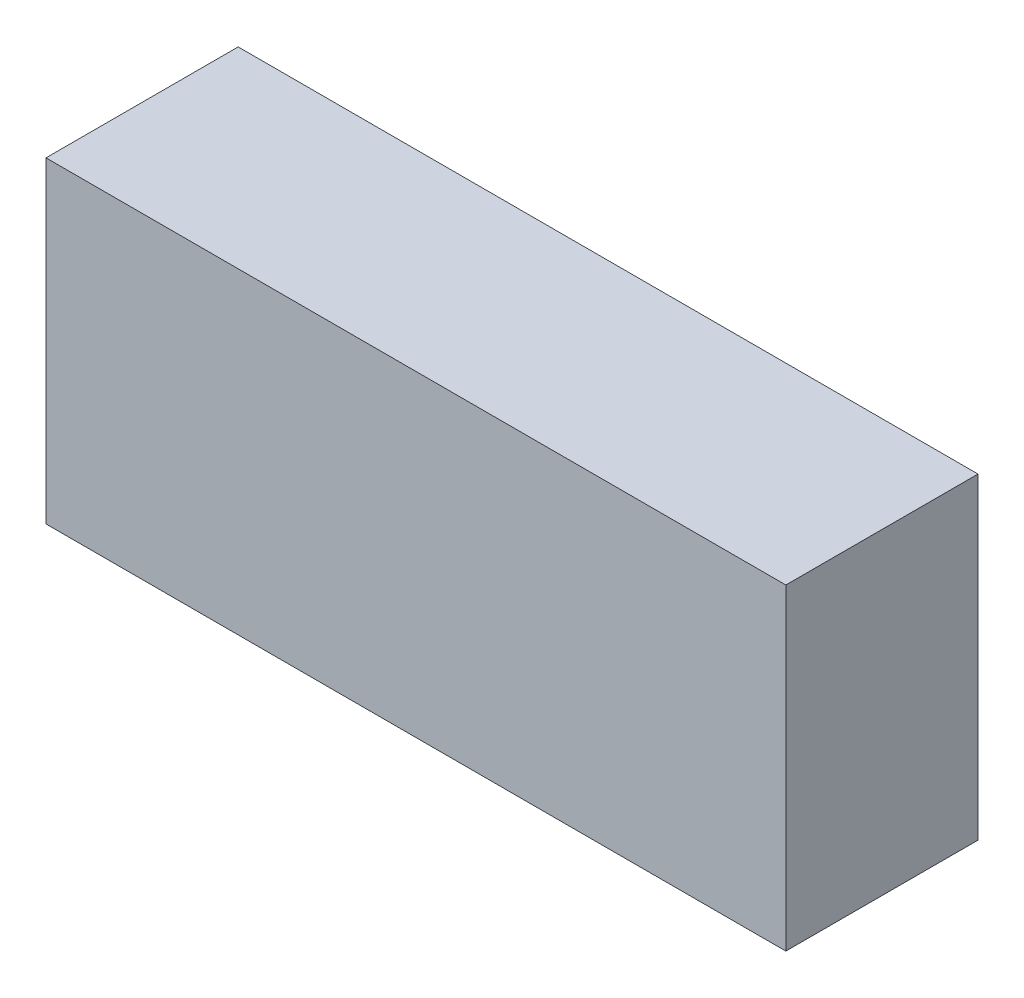
ISO-10303-21;
HEADER;
FILE_DESCRIPTION(('STEP AP214'),'2;1');
FILE_NAME('part.step','',(''),(''),'','','');
FILE_SCHEMA(('AUTOMOTIVE_DESIGN { 1 0 10303 214 1 1 1 1 }'));
ENDSEC;
DATA;
#1=APPLICATION_CONTEXT('core data for automotive mechanical design processes');
#2=APPLICATION_PROTOCOL_DEFINITION('international standard','automotive_design',2000,#1);
#3=PRODUCT_CONTEXT('',#1,'mechanical');
#4=PRODUCT('Part','Part','',(#3));
#5=PRODUCT_RELATED_PRODUCT_CATEGORY('part','',(#4));
#6=PRODUCT_DEFINITION_FORMATION('','',#4);
#7=PRODUCT_DEFINITION_CONTEXT('part definition',#1,'design');
#8=PRODUCT_DEFINITION('design','',#6,#7);
#9=PRODUCT_DEFINITION_SHAPE('','',#8);
#10=(LENGTH_UNIT() NAMED_UNIT(*) SI_UNIT(.MILLI.,.METRE.));
#11=(NAMED_UNIT(*) PLANE_ANGLE_UNIT() SI_UNIT($,.RADIAN.));
#12=(NAMED_UNIT(*) SI_UNIT($,.STERADIAN.) SOLID_ANGLE_UNIT());
#13=UNCERTAINTY_MEASURE_WITH_UNIT(LENGTH_MEASURE(1.E-05),#10,'distance_accuracy_value','');
#14=(GEOMETRIC_REPRESENTATION_CONTEXT(3) GLOBAL_UNCERTAINTY_ASSIGNED_CONTEXT((#13)) GLOBAL_UNIT_ASSIGNED_CONTEXT((#10,
#11,#12)) REPRESENTATION_CONTEXT('',''));
#15=CARTESIAN_POINT('',(0.,0.,0.));
#16=DIRECTION('',(0.,0.,1.));
#17=DIRECTION('',(1.,0.,0.));
#18=AXIS2_PLACEMENT_3D('',#15,#16,#17);
#19=CARTESIAN_POINT('',(-36.9115954057455,17.8414634146341,20.));
#20=DIRECTION('',(1.,0.,0.));
#21=DIRECTION('',(0.,1.,0.));
#22=AXIS2_PLACEMENT_3D('',#19,#20,#21);
#23=PLANE('',#22);
#24=DIRECTION('',(0.,-1.,0.));
#25=VECTOR('',#24,1.);
#26=CARTESIAN_POINT('',(-36.9115954057455,17.8414634146341,0.));
#27=LINE('',#26,#25);
#28=CARTESIAN_POINT('',(-36.9115954057455,17.8414634146341,0.));
#29=VERTEX_POINT('',#28);
#30=CARTESIAN_POINT('',(-36.9115954057455,-15.1585365853659,0.));
#31=VERTEX_POINT('',#30);
#32=EDGE_CURVE('E96',#29,#31,#27,.T.);
#33=ORIENTED_EDGE('',*,*,#32,.T.);
#34=DIRECTION('',(0.,0.,-1.));
#35=VECTOR('',#34,1.);
#36=CARTESIAN_POINT('',(-36.9115954057455,-15.1585365853659,20.));
#37=LINE('',#36,#35);
#38=CARTESIAN_POINT('',(-36.9115954057455,-15.1585365853659,20.));
#39=VERTEX_POINT('',#38);
#40=EDGE_CURVE('E11',#39,#31,#37,.T.);
#41=ORIENTED_EDGE('',*,*,#40,.F.);
#42=DIRECTION('',(0.,-1.,0.));
#43=VECTOR('',#42,1.);
#44=CARTESIAN_POINT('',(-36.9115954057455,17.8414634146341,20.));
#45=LINE('',#44,#43);
#46=CARTESIAN_POINT('',(-36.9115954057455,17.8414634146341,20.));
#47=VERTEX_POINT('',#46);
#48=EDGE_CURVE('E84',#47,#39,#45,.T.);
#49=ORIENTED_EDGE('',*,*,#48,.F.);
#50=DIRECTION('',(0.,0.,-1.));
#51=VECTOR('',#50,1.);
#52=CARTESIAN_POINT('',(-36.9115954057455,17.8414634146341,20.));
#53=LINE('',#52,#51);
#54=EDGE_CURVE('E92',#47,#29,#53,.T.);
#55=ORIENTED_EDGE('',*,*,#54,.T.);
#56=EDGE_LOOP('',(#33,#41,#49,#55));
#57=FACE_BOUND('',#56,.T.);
#58=ADVANCED_FACE('F33',(#57),#23,.F.);
#59=CARTESIAN_POINT('',(-36.9115954057455,-15.1585365853659,20.));
#60=DIRECTION('',(0.,1.,0.));
#61=DIRECTION('',(0.,0.,1.));
#62=AXIS2_PLACEMENT_3D('',#59,#60,#61);
#63=PLANE('',#62);
#64=DIRECTION('',(1.,0.,0.));
#65=VECTOR('',#64,1.);
#66=CARTESIAN_POINT('',(-36.9115954057455,-15.1585365853659,0.));
#67=LINE('',#66,#65);
#68=CARTESIAN_POINT('',(40.0884045942546,-15.1585365853659,0.));
#69=VERTEX_POINT('',#68);
#70=EDGE_CURVE('E88',#31,#69,#67,.T.);
#71=ORIENTED_EDGE('',*,*,#70,.T.);
#72=DIRECTION('',(0.,0.,-1.));
#73=VECTOR('',#72,1.);
#74=CARTESIAN_POINT('',(40.0884045942546,-15.1585365853659,20.));
#75=LINE('',#74,#73);
#76=CARTESIAN_POINT('',(40.0884045942546,-15.1585365853659,20.));
#77=VERTEX_POINT('',#76);
#78=EDGE_CURVE('E41',#77,#69,#75,.T.);
#79=ORIENTED_EDGE('',*,*,#78,.F.);
#80=DIRECTION('',(1.,0.,0.));
#81=VECTOR('',#80,1.);
#82=CARTESIAN_POINT('',(-36.9115954057455,-15.1585365853659,20.));
#83=LINE('',#82,#81);
#84=EDGE_CURVE('E79',#39,#77,#83,.T.);
#85=ORIENTED_EDGE('',*,*,#84,.F.);
#86=ORIENTED_EDGE('',*,*,#40,.T.);
#87=EDGE_LOOP('',(#71,#79,#85,#86));
#88=FACE_BOUND('',#87,.T.);
#89=ADVANCED_FACE('F87',(#88),#63,.F.);
#90=CARTESIAN_POINT('',(40.0884045942545,17.8414634146341,20.));
#91=DIRECTION('',(-1.,0.,0.));
#92=DIRECTION('',(0.,-1.,0.));
#93=AXIS2_PLACEMENT_3D('',#90,#91,#92);
#94=PLANE('',#93);
#95=DIRECTION('',(0.,1.,0.));
#96=VECTOR('',#95,1.);
#97=CARTESIAN_POINT('',(40.0884045942545,17.8414634146341,0.));
#98=LINE('',#97,#96);
#99=CARTESIAN_POINT('',(40.0884045942545,17.8414634146341,0.));
#100=VERTEX_POINT('',#99);
#101=EDGE_CURVE('E66',#69,#100,#98,.T.);
#102=ORIENTED_EDGE('',*,*,#101,.T.);
#103=DIRECTION('',(0.,0.,-1.));
#104=VECTOR('',#103,1.);
#105=CARTESIAN_POINT('',(40.0884045942545,17.8414634146341,20.));
#106=LINE('',#105,#104);
#107=CARTESIAN_POINT('',(40.0884045942545,17.8414634146341,20.));
#108=VERTEX_POINT('',#107);
#109=EDGE_CURVE('E89',#108,#100,#106,.T.);
#110=ORIENTED_EDGE('',*,*,#109,.F.);
#111=DIRECTION('',(0.,1.,0.));
#112=VECTOR('',#111,1.);
#113=CARTESIAN_POINT('',(40.0884045942545,17.8414634146341,20.));
#114=LINE('',#113,#112);
#115=EDGE_CURVE('E82',#77,#108,#114,.T.);
#116=ORIENTED_EDGE('',*,*,#115,.F.);
#117=ORIENTED_EDGE('',*,*,#78,.T.);
#118=EDGE_LOOP('',(#102,#110,#116,#117));
#119=FACE_BOUND('',#118,.T.);
#120=ADVANCED_FACE('F90',(#119),#94,.F.);
#121=CARTESIAN_POINT('',(-36.9115954057455,17.8414634146341,20.));
#122=DIRECTION('',(0.,-1.,0.));
#123=DIRECTION('',(0.,0.,-1.));
#124=AXIS2_PLACEMENT_3D('',#121,#122,#123);
#125=PLANE('',#124);
#126=DIRECTION('',(-1.,0.,0.));
#127=VECTOR('',#126,1.);
#128=CARTESIAN_POINT('',(-36.9115954057455,17.8414634146341,0.));
#129=LINE('',#128,#127);
#130=EDGE_CURVE('E72',#100,#29,#129,.T.);
#131=ORIENTED_EDGE('',*,*,#130,.T.);
#132=ORIENTED_EDGE('',*,*,#54,.F.);
#133=DIRECTION('',(-1.,0.,0.));
#134=VECTOR('',#133,1.);
#135=CARTESIAN_POINT('',(-36.9115954057455,17.8414634146341,20.));
#136=LINE('',#135,#134);
#137=EDGE_CURVE('E49',#108,#47,#136,.T.);
#138=ORIENTED_EDGE('',*,*,#137,.F.);
#139=ORIENTED_EDGE('',*,*,#109,.T.);
#140=EDGE_LOOP('',(#131,#132,#138,#139));
#141=FACE_BOUND('',#140,.T.);
#142=ADVANCED_FACE('F103',(#141),#125,.F.);
#143=CARTESIAN_POINT('',(0.,0.,20.));
#144=DIRECTION('',(0.,0.,1.));
#145=DIRECTION('',(1.,0.,0.));
#146=AXIS2_PLACEMENT_3D('',#143,#144,#145);
#147=PLANE('',#146);
#148=ORIENTED_EDGE('',*,*,#48,.T.);
#149=ORIENTED_EDGE('',*,*,#84,.T.);
#150=ORIENTED_EDGE('',*,*,#115,.T.);
#151=ORIENTED_EDGE('',*,*,#137,.T.);
#152=EDGE_LOOP('',(#148,#149,#150,#151));
#153=FACE_BOUND('',#152,.T.);
#154=ADVANCED_FACE('F80',(#153),#147,.T.);
#155=CARTESIAN_POINT('',(0.,0.,0.));
#156=DIRECTION('',(0.,0.,1.));
#157=DIRECTION('',(1.,0.,0.));
#158=AXIS2_PLACEMENT_3D('',#155,#156,#157);
#159=PLANE('',#158);
#160=ORIENTED_EDGE('',*,*,#32,.F.);
#161=ORIENTED_EDGE('',*,*,#130,.F.);
#162=ORIENTED_EDGE('',*,*,#101,.F.);
#163=ORIENTED_EDGE('',*,*,#70,.F.);
#164=EDGE_LOOP('',(#160,#161,#162,#163));
#165=FACE_BOUND('',#164,.T.);
#166=ADVANCED_FACE('F106',(#165),#159,.F.);
#167=CLOSED_SHELL('',(#58,#89,#120,#142,#154,#166));
#168=MANIFOLD_SOLID_BREP('B2',#167);
#169=ADVANCED_BREP_SHAPE_REPRESENTATION('',(#18,#168),#14);
#170=SHAPE_DEFINITION_REPRESENTATION(#9,#169);
ENDSEC;
END-ISO-10303-21;
